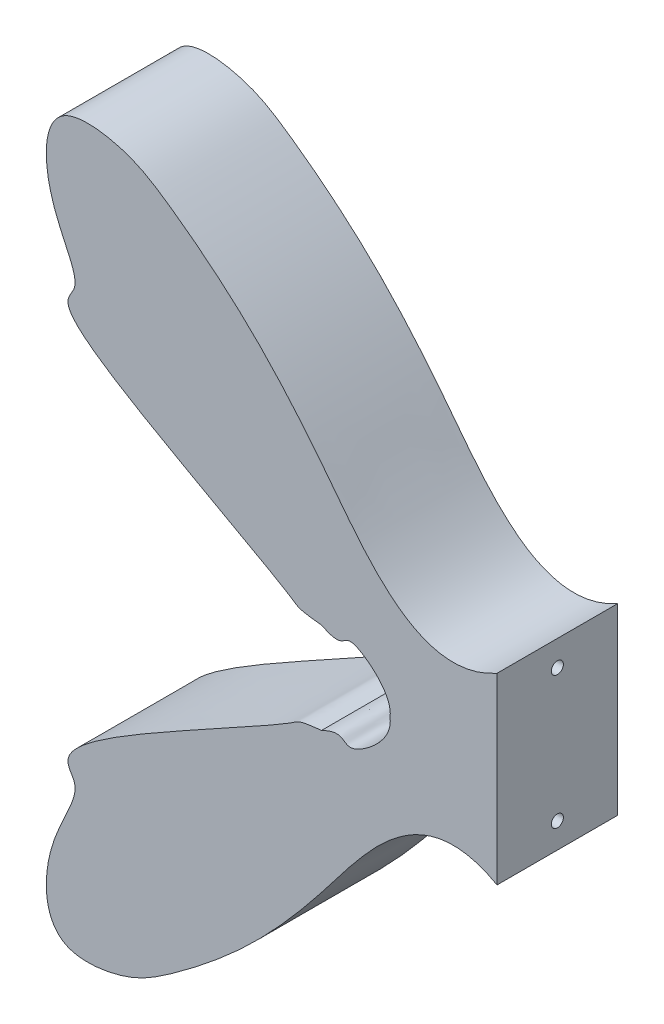
ISO-10303-21;
HEADER;
FILE_DESCRIPTION(('STEP AP214'),'2;1');
FILE_NAME('part.step','',(''),(''),'','','');
FILE_SCHEMA(('AUTOMOTIVE_DESIGN { 1 0 10303 214 1 1 1 1 }'));
ENDSEC;
DATA;
#1=APPLICATION_CONTEXT('core data for automotive mechanical design processes');
#2=APPLICATION_PROTOCOL_DEFINITION('international standard','automotive_design',2000,#1);
#3=PRODUCT_CONTEXT('',#1,'mechanical');
#4=PRODUCT('Part','Part','',(#3));
#5=PRODUCT_RELATED_PRODUCT_CATEGORY('part','',(#4));
#6=PRODUCT_DEFINITION_FORMATION('','',#4);
#7=PRODUCT_DEFINITION_CONTEXT('part definition',#1,'design');
#8=PRODUCT_DEFINITION('design','',#6,#7);
#9=PRODUCT_DEFINITION_SHAPE('','',#8);
#10=(LENGTH_UNIT() NAMED_UNIT(*) SI_UNIT(.MILLI.,.METRE.));
#11=(NAMED_UNIT(*) PLANE_ANGLE_UNIT() SI_UNIT($,.RADIAN.));
#12=(NAMED_UNIT(*) SI_UNIT($,.STERADIAN.) SOLID_ANGLE_UNIT());
#13=UNCERTAINTY_MEASURE_WITH_UNIT(LENGTH_MEASURE(1.E-05),#10,'distance_accuracy_value','');
#14=(GEOMETRIC_REPRESENTATION_CONTEXT(3) GLOBAL_UNCERTAINTY_ASSIGNED_CONTEXT((#13)) GLOBAL_UNIT_ASSIGNED_CONTEXT((#10,
#11,#12)) REPRESENTATION_CONTEXT('',''));
#15=CARTESIAN_POINT('',(0.,0.,0.));
#16=DIRECTION('',(0.,0.,1.));
#17=DIRECTION('',(1.,0.,0.));
#18=AXIS2_PLACEMENT_3D('',#15,#16,#17);
#19=CARTESIAN_POINT('',(71.6325104062925,15.197185343307,10.));
#20=DIRECTION('',(1.,0.,0.));
#21=DIRECTION('',(0.,0.,-1.));
#22=AXIS2_PLACEMENT_3D('',#19,#20,#21);
#23=PLANE('',#22);
#24=CARTESIAN_POINT('',(71.6325104062925,-11.,0.));
#25=DIRECTION('',(1.,0.,0.));
#26=DIRECTION('',(0.,0.,1.));
#27=AXIS2_PLACEMENT_3D('',#24,#25,#26);
#28=CIRCLE('',#27,1.);
#29=CARTESIAN_POINT('',(71.6325104062925,-11.,1.));
#30=VERTEX_POINT('',#29);
#31=EDGE_CURVE('E142',#30,#30,#28,.T.);
#32=ORIENTED_EDGE('',*,*,#31,.F.);
#33=EDGE_LOOP('',(#32));
#34=FACE_BOUND('',#33,.T.);
#35=CARTESIAN_POINT('',(71.6325104062925,11.,0.));
#36=DIRECTION('',(1.,0.,0.));
#37=DIRECTION('',(0.,0.,-1.));
#38=AXIS2_PLACEMENT_3D('',#35,#36,#37);
#39=CIRCLE('',#38,1.);
#40=CARTESIAN_POINT('',(71.6325104062925,11.,-1.));
#41=VERTEX_POINT('',#40);
#42=EDGE_CURVE('E145',#41,#41,#39,.T.);
#43=ORIENTED_EDGE('',*,*,#42,.F.);
#44=EDGE_LOOP('',(#43));
#45=FACE_BOUND('',#44,.T.);
#46=DIRECTION('',(0.,-1.,0.));
#47=VECTOR('',#46,1.);
#48=CARTESIAN_POINT('',(71.6325104062925,15.197185343307,-10.));
#49=LINE('',#48,#47);
#50=CARTESIAN_POINT('',(71.6325104062925,15.197185343307,-10.));
#51=VERTEX_POINT('',#50);
#52=CARTESIAN_POINT('',(71.6325104062925,-15.197185343307,-10.));
#53=VERTEX_POINT('',#52);
#54=EDGE_CURVE('E147',#51,#53,#49,.T.);
#55=ORIENTED_EDGE('',*,*,#54,.F.);
#56=DIRECTION('',(0.,0.,-1.));
#57=VECTOR('',#56,1.);
#58=CARTESIAN_POINT('',(71.6325104062925,15.197185343307,10.));
#59=LINE('',#58,#57);
#60=CARTESIAN_POINT('',(71.6325104062925,15.197185343307,10.));
#61=VERTEX_POINT('',#60);
#62=EDGE_CURVE('E11',#61,#51,#59,.T.);
#63=ORIENTED_EDGE('',*,*,#62,.F.);
#64=DIRECTION('',(0.,-1.,0.));
#65=VECTOR('',#64,1.);
#66=CARTESIAN_POINT('',(71.6325104062925,15.197185343307,10.));
#67=LINE('',#66,#65);
#68=CARTESIAN_POINT('',(71.6325104062925,-15.197185343307,10.));
#69=VERTEX_POINT('',#68);
#70=EDGE_CURVE('E106',#61,#69,#67,.T.);
#71=ORIENTED_EDGE('',*,*,#70,.T.);
#72=DIRECTION('',(0.,0.,-1.));
#73=VECTOR('',#72,1.);
#74=CARTESIAN_POINT('',(71.6325104062925,-15.197185343307,10.));
#75=LINE('',#74,#73);
#76=EDGE_CURVE('E35',#69,#53,#75,.T.);
#77=ORIENTED_EDGE('',*,*,#76,.T.);
#78=EDGE_LOOP('',(#55,#63,#71,#77));
#79=FACE_BOUND('',#78,.T.);
#80=ADVANCED_FACE('F32',(#34,#45,#79),#23,.T.);
#81=CARTESIAN_POINT('',(71.6325104062925,15.197185343307,10.));
#82=CARTESIAN_POINT('',(58.973888961801,8.0992342581893,10.));
#83=CARTESIAN_POINT('',(42.5680847183413,32.1575794687666,10.));
#84=CARTESIAN_POINT('',(28.361465025115,46.9535549101706,10.));
#85=CARTESIAN_POINT('',(16.4401867788423,55.9729933179655,10.));
#86=CARTESIAN_POINT('',(10.1282616814328,59.7584346686399,10.));
#87=CARTESIAN_POINT('',(-3.89444364924594,61.5978068543474,10.));
#88=CARTESIAN_POINT('',(-3.7829333087954,46.5834367053853,10.));
#89=CARTESIAN_POINT('',(4.75028643331209,33.6618351777044,10.));
#90=CARTESIAN_POINT('',(-6.00395995488576,32.3535590104221,10.));
#91=CARTESIAN_POINT('',(39.7190789756731,8.26661727159354,10.));
#92=CARTESIAN_POINT('',(38.5367870304603,8.00469770466996,10.));
#93=CARTESIAN_POINT('',(42.5385919506701,7.55434647529955,10.));
#94=B_SPLINE_CURVE_WITH_KNOTS('',3,(#81,#82,#83,#84,#85,#86,#87,#88,#89,#90,#91,#92,#93),
.UNSPECIFIED.,.F.,.F.,(4,1,1,1,1,1,1,1,1,1,4),(0.,0.127762807601043,0.242354711028437,
0.328153111034359,0.413844964762527,0.506383100526549,0.653085728314985,0.740125662354629,
0.845652717034787,0.902495187579424,0.926083421966984),.UNSPECIFIED.);
#95=DIRECTION('',(0.,0.,-1.));
#96=VECTOR('',#95,1.);
#97=SURFACE_OF_LINEAR_EXTRUSION('',#94,#96);
#98=CARTESIAN_POINT('',(71.6325104062925,15.197185343307,-10.));
#99=CARTESIAN_POINT('',(58.973888961801,8.0992342581893,-10.));
#100=CARTESIAN_POINT('',(42.5680847183413,32.1575794687666,-10.));
#101=CARTESIAN_POINT('',(28.361465025115,46.9535549101706,-10.));
#102=CARTESIAN_POINT('',(16.4401867788423,55.9729933179655,-10.));
#103=CARTESIAN_POINT('',(10.1282616814328,59.7584346686399,-10.));
#104=CARTESIAN_POINT('',(-3.89444364924594,61.5978068543474,-10.));
#105=CARTESIAN_POINT('',(-3.7829333087954,46.5834367053853,-10.));
#106=CARTESIAN_POINT('',(4.75028643331209,33.6618351777044,-10.));
#107=CARTESIAN_POINT('',(-6.00395995488576,32.3535590104221,-10.));
#108=CARTESIAN_POINT('',(39.7190789756731,8.26661727159354,-10.));
#109=CARTESIAN_POINT('',(38.5367870304603,8.00469770466996,-10.));
#110=CARTESIAN_POINT('',(42.5385919506701,7.55434647529955,-10.));
#111=B_SPLINE_CURVE_WITH_KNOTS('',3,(#98,#99,#100,#101,#102,#103,#104,#105,#106,#107,#108,#109,
#110),.UNSPECIFIED.,.F.,.F.,(4,1,1,1,1,1,1,1,1,1,4),(0.,0.127762807601043,0.242354711028437,
0.328153111034359,0.413844964762527,0.506383100526549,0.653085728314985,0.740125662354629,
0.845652717034787,0.902495187579424,0.926083421966984),.UNSPECIFIED.);
#112=CARTESIAN_POINT('',(42.5385919506701,7.55434647529955,-10.));
#113=VERTEX_POINT('',#112);
#114=EDGE_CURVE('E68',#51,#113,#111,.T.);
#115=ORIENTED_EDGE('',*,*,#114,.T.);
#116=DIRECTION('',(0.,0.,-1.));
#117=VECTOR('',#116,1.);
#118=CARTESIAN_POINT('',(42.5385919506701,7.55434647529955,10.));
#119=LINE('',#118,#117);
#120=CARTESIAN_POINT('',(42.5385919506701,7.55434647529955,10.));
#121=VERTEX_POINT('',#120);
#122=EDGE_CURVE('E41',#121,#113,#119,.T.);
#123=ORIENTED_EDGE('',*,*,#122,.F.);
#124=EDGE_CURVE('E90',#61,#121,#94,.T.);
#125=ORIENTED_EDGE('',*,*,#124,.F.);
#126=ORIENTED_EDGE('',*,*,#62,.T.);
#127=EDGE_LOOP('',(#115,#123,#125,#126));
#128=FACE_BOUND('',#127,.T.);
#129=ADVANCED_FACE('F134',(#128),#97,.F.);
#130=CARTESIAN_POINT('',(42.5385919506701,7.55434647529956,10.));
#131=CARTESIAN_POINT('',(47.0321058161497,5.30963101815585,10.));
#132=CARTESIAN_POINT('',(44.7788716135947,10.9369157337731,10.));
#133=CARTESIAN_POINT('',(54.3379106103023,3.13433053936766,10.));
#134=CARTESIAN_POINT('',(53.892711990341,0.,10.));
#135=B_SPLINE_CURVE_WITH_KNOTS('',3,(#130,#131,#132,#133,#134),.UNSPECIFIED.,.F.,.F.,(4,1,4),
(0.,0.786447222862614,1.26700053070628),.UNSPECIFIED.);
#136=DIRECTION('',(0.,0.,-1.));
#137=VECTOR('',#136,1.);
#138=SURFACE_OF_LINEAR_EXTRUSION('',#135,#137);
#139=CARTESIAN_POINT('',(42.5385919506701,7.55434647529956,-10.));
#140=CARTESIAN_POINT('',(47.0321058161497,5.30963101815585,-10.));
#141=CARTESIAN_POINT('',(44.7788716135947,10.9369157337731,-10.));
#142=CARTESIAN_POINT('',(54.3379106103023,3.13433053936766,-10.));
#143=CARTESIAN_POINT('',(53.892711990341,0.,-10.));
#144=B_SPLINE_CURVE_WITH_KNOTS('',3,(#139,#140,#141,#142,#143),.UNSPECIFIED.,.F.,.F.,(4,1,4),
(0.,0.786447222862614,1.26700053070628),.UNSPECIFIED.);
#145=CARTESIAN_POINT('',(53.892711990341,0.,-10.));
#146=VERTEX_POINT('',#145);
#147=EDGE_CURVE('E97',#113,#146,#144,.T.);
#148=ORIENTED_EDGE('',*,*,#147,.T.);
#149=DIRECTION('',(0.,0.,-1.));
#150=VECTOR('',#149,1.);
#151=CARTESIAN_POINT('',(53.892711990341,0.,10.));
#152=LINE('',#151,#150);
#153=CARTESIAN_POINT('',(53.892711990341,0.,10.));
#154=VERTEX_POINT('',#153);
#155=EDGE_CURVE('E94',#154,#146,#152,.T.);
#156=ORIENTED_EDGE('',*,*,#155,.F.);
#157=EDGE_CURVE('E84',#121,#154,#135,.T.);
#158=ORIENTED_EDGE('',*,*,#157,.F.);
#159=ORIENTED_EDGE('',*,*,#122,.T.);
#160=EDGE_LOOP('',(#148,#156,#158,#159));
#161=FACE_BOUND('',#160,.T.);
#162=ADVANCED_FACE('F95',(#161),#138,.F.);
#163=CARTESIAN_POINT('',(42.5385919506701,-7.55434647529956,10.));
#164=CARTESIAN_POINT('',(47.0321058161497,-5.30963101815585,10.));
#165=CARTESIAN_POINT('',(44.7788716135947,-10.9369157337731,10.));
#166=CARTESIAN_POINT('',(54.3379106103023,-3.13433053936766,10.));
#167=CARTESIAN_POINT('',(53.892711990341,0.,10.));
#168=B_SPLINE_CURVE_WITH_KNOTS('',3,(#163,#164,#165,#166,#167),.UNSPECIFIED.,.F.,.F.,(4,1,4),
(0.,0.786447222862614,1.26700053070628),.UNSPECIFIED.);
#169=DIRECTION('',(0.,0.,-1.));
#170=VECTOR('',#169,1.);
#171=SURFACE_OF_LINEAR_EXTRUSION('',#168,#170);
#172=CARTESIAN_POINT('',(42.5385919506701,-7.55434647529956,-10.));
#173=CARTESIAN_POINT('',(47.0321058161497,-5.30963101815585,-10.));
#174=CARTESIAN_POINT('',(44.7788716135947,-10.9369157337731,-10.));
#175=CARTESIAN_POINT('',(54.3379106103023,-3.13433053936766,-10.));
#176=CARTESIAN_POINT('',(53.892711990341,0.,-10.));
#177=B_SPLINE_CURVE_WITH_KNOTS('',3,(#172,#173,#174,#175,#176),.UNSPECIFIED.,.F.,.F.,(4,1,4),
(0.,0.786447222862614,1.26700053070628),.UNSPECIFIED.);
#178=CARTESIAN_POINT('',(42.5385919506701,-7.55434647529956,-10.));
#179=VERTEX_POINT('',#178);
#180=EDGE_CURVE('E153',#179,#146,#177,.T.);
#181=ORIENTED_EDGE('',*,*,#180,.F.);
#182=DIRECTION('',(0.,0.,-1.));
#183=VECTOR('',#182,1.);
#184=CARTESIAN_POINT('',(42.5385919506701,-7.55434647529956,10.));
#185=LINE('',#184,#183);
#186=CARTESIAN_POINT('',(42.5385919506701,-7.55434647529956,10.));
#187=VERTEX_POINT('',#186);
#188=EDGE_CURVE('E101',#187,#179,#185,.T.);
#189=ORIENTED_EDGE('',*,*,#188,.F.);
#190=EDGE_CURVE('E89',#187,#154,#168,.T.);
#191=ORIENTED_EDGE('',*,*,#190,.T.);
#192=ORIENTED_EDGE('',*,*,#155,.T.);
#193=EDGE_LOOP('',(#181,#189,#191,#192));
#194=FACE_BOUND('',#193,.T.);
#195=ADVANCED_FACE('F103',(#194),#171,.T.);
#196=CARTESIAN_POINT('',(71.6325104062925,-15.197185343307,10.));
#197=CARTESIAN_POINT('',(58.973888961801,-8.09923425818933,10.));
#198=CARTESIAN_POINT('',(42.5680847183413,-32.1575794687666,10.));
#199=CARTESIAN_POINT('',(28.361465025115,-46.9535549101706,10.));
#200=CARTESIAN_POINT('',(16.4401867788423,-55.9729933179655,10.));
#201=CARTESIAN_POINT('',(10.1282616814328,-59.7584346686399,10.));
#202=CARTESIAN_POINT('',(-3.89444364924594,-61.5978068543474,10.));
#203=CARTESIAN_POINT('',(-3.7829333087954,-46.5834367053853,10.));
#204=CARTESIAN_POINT('',(4.75028643331208,-33.6618351777044,10.));
#205=CARTESIAN_POINT('',(-6.00395995488576,-32.3535590104222,10.));
#206=CARTESIAN_POINT('',(39.719078975673,-8.26661727159354,10.));
#207=CARTESIAN_POINT('',(38.5367870304603,-8.00469770466996,10.));
#208=CARTESIAN_POINT('',(42.5385919506701,-7.55434647529955,10.));
#209=B_SPLINE_CURVE_WITH_KNOTS('',3,(#196,#197,#198,#199,#200,#201,#202,#203,#204,#205,#206,
#207,#208),.UNSPECIFIED.,.F.,.F.,(4,1,1,1,1,1,1,1,1,1,4),(0.,0.127762807601043,
0.242354711028437,0.328153111034359,0.413844964762527,0.506383100526549,0.653085728314985,
0.740125662354629,0.845652717034787,0.902495187579424,0.926083421966984),.UNSPECIFIED.);
#210=DIRECTION('',(0.,0.,-1.));
#211=VECTOR('',#210,1.);
#212=SURFACE_OF_LINEAR_EXTRUSION('',#209,#211);
#213=CARTESIAN_POINT('',(71.6325104062925,-15.197185343307,-10.));
#214=CARTESIAN_POINT('',(58.973888961801,-8.09923425818933,-10.));
#215=CARTESIAN_POINT('',(42.5680847183413,-32.1575794687666,-10.));
#216=CARTESIAN_POINT('',(28.361465025115,-46.9535549101706,-10.));
#217=CARTESIAN_POINT('',(16.4401867788423,-55.9729933179655,-10.));
#218=CARTESIAN_POINT('',(10.1282616814328,-59.7584346686399,-10.));
#219=CARTESIAN_POINT('',(-3.89444364924594,-61.5978068543474,-10.));
#220=CARTESIAN_POINT('',(-3.7829333087954,-46.5834367053853,-10.));
#221=CARTESIAN_POINT('',(4.75028643331208,-33.6618351777044,-10.));
#222=CARTESIAN_POINT('',(-6.00395995488576,-32.3535590104222,-10.));
#223=CARTESIAN_POINT('',(39.719078975673,-8.26661727159354,-10.));
#224=CARTESIAN_POINT('',(38.5367870304603,-8.00469770466996,-10.));
#225=CARTESIAN_POINT('',(42.5385919506701,-7.55434647529955,-10.));
#226=B_SPLINE_CURVE_WITH_KNOTS('',3,(#213,#214,#215,#216,#217,#218,#219,#220,#221,#222,#223,
#224,#225),.UNSPECIFIED.,.F.,.F.,(4,1,1,1,1,1,1,1,1,1,4),(0.,0.127762807601043,
0.242354711028437,0.328153111034359,0.413844964762527,0.506383100526549,0.653085728314985,
0.740125662354629,0.845652717034787,0.902495187579424,0.926083421966984),.UNSPECIFIED.);
#227=EDGE_CURVE('E150',#53,#179,#226,.T.);
#228=ORIENTED_EDGE('',*,*,#227,.F.);
#229=ORIENTED_EDGE('',*,*,#76,.F.);
#230=EDGE_CURVE('E104',#69,#187,#209,.T.);
#231=ORIENTED_EDGE('',*,*,#230,.T.);
#232=ORIENTED_EDGE('',*,*,#188,.T.);
#233=EDGE_LOOP('',(#228,#229,#231,#232));
#234=FACE_BOUND('',#233,.T.);
#235=ADVANCED_FACE('F125',(#234),#212,.T.);
#236=CARTESIAN_POINT('',(4.1932775577435,-60.2343827134994,10.));
#237=DIRECTION('',(0.,0.,-1.));
#238=DIRECTION('',(-1.,0.,0.));
#239=AXIS2_PLACEMENT_3D('',#236,#237,#238);
#240=PLANE('',#239);
#241=ORIENTED_EDGE('',*,*,#70,.F.);
#242=ORIENTED_EDGE('',*,*,#124,.T.);
#243=ORIENTED_EDGE('',*,*,#157,.T.);
#244=ORIENTED_EDGE('',*,*,#190,.F.);
#245=ORIENTED_EDGE('',*,*,#230,.F.);
#246=EDGE_LOOP('',(#241,#242,#243,#244,#245));
#247=FACE_BOUND('',#246,.T.);
#248=ADVANCED_FACE('F87',(#247),#240,.F.);
#249=CARTESIAN_POINT('',(4.1932775577435,-60.2343827134994,-10.));
#250=DIRECTION('',(0.,0.,-1.));
#251=DIRECTION('',(-1.,0.,0.));
#252=AXIS2_PLACEMENT_3D('',#249,#250,#251);
#253=PLANE('',#252);
#254=ORIENTED_EDGE('',*,*,#54,.T.);
#255=ORIENTED_EDGE('',*,*,#227,.T.);
#256=ORIENTED_EDGE('',*,*,#180,.T.);
#257=ORIENTED_EDGE('',*,*,#147,.F.);
#258=ORIENTED_EDGE('',*,*,#114,.F.);
#259=EDGE_LOOP('',(#254,#255,#256,#257,#258));
#260=FACE_BOUND('',#259,.T.);
#261=ADVANCED_FACE('F131',(#260),#253,.T.);
#262=CARTESIAN_POINT('',(66.6325104062925,11.,0.));
#263=DIRECTION('',(1.,0.,0.));
#264=DIRECTION('',(0.,0.,-1.));
#265=AXIS2_PLACEMENT_3D('',#262,#263,#264);
#266=CYLINDRICAL_SURFACE('',#265,1.);
#267=CARTESIAN_POINT('',(66.6325104062925,11.,0.));
#268=DIRECTION('',(1.,0.,0.));
#269=DIRECTION('',(0.,0.,-1.));
#270=AXIS2_PLACEMENT_3D('',#267,#268,#269);
#271=CIRCLE('',#270,1.);
#272=CARTESIAN_POINT('',(66.6325104062925,11.,-1.));
#273=VERTEX_POINT('',#272);
#274=EDGE_CURVE('E151',#273,#273,#271,.T.);
#275=ORIENTED_EDGE('',*,*,#274,.F.);
#276=EDGE_LOOP('',(#275));
#277=FACE_BOUND('',#276,.T.);
#278=ORIENTED_EDGE('',*,*,#42,.T.);
#279=EDGE_LOOP('',(#278));
#280=FACE_BOUND('',#279,.T.);
#281=ADVANCED_FACE('F185',(#277,#280),#266,.F.);
#282=CARTESIAN_POINT('',(66.6325104062925,11.,0.));
#283=DIRECTION('',(1.,0.,0.));
#284=DIRECTION('',(0.,0.,-1.));
#285=AXIS2_PLACEMENT_3D('',#282,#283,#284);
#286=PLANE('',#285);
#287=ORIENTED_EDGE('',*,*,#274,.T.);
#288=EDGE_LOOP('',(#287));
#289=FACE_BOUND('',#288,.T.);
#290=ADVANCED_FACE('F190',(#289),#286,.T.);
#291=CARTESIAN_POINT('',(66.6325104062925,-11.,0.));
#292=DIRECTION('',(1.,0.,0.));
#293=DIRECTION('',(0.,0.,-1.));
#294=AXIS2_PLACEMENT_3D('',#291,#292,#293);
#295=CYLINDRICAL_SURFACE('',#294,1.);
#296=CARTESIAN_POINT('',(66.6325104062925,-11.,0.));
#297=DIRECTION('',(1.,0.,0.));
#298=DIRECTION('',(0.,0.,1.));
#299=AXIS2_PLACEMENT_3D('',#296,#297,#298);
#300=CIRCLE('',#299,1.);
#301=CARTESIAN_POINT('',(66.6325104062925,-11.,1.));
#302=VERTEX_POINT('',#301);
#303=EDGE_CURVE('E208',#302,#302,#300,.T.);
#304=ORIENTED_EDGE('',*,*,#303,.F.);
#305=EDGE_LOOP('',(#304));
#306=FACE_BOUND('',#305,.T.);
#307=ORIENTED_EDGE('',*,*,#31,.T.);
#308=EDGE_LOOP('',(#307));
#309=FACE_BOUND('',#308,.T.);
#310=ADVANCED_FACE('F196',(#306,#309),#295,.F.);
#311=CARTESIAN_POINT('',(66.6325104062925,-11.,0.));
#312=DIRECTION('',(-1.,0.,0.));
#313=DIRECTION('',(0.,0.,1.));
#314=AXIS2_PLACEMENT_3D('',#311,#312,#313);
#315=PLANE('',#314);
#316=ORIENTED_EDGE('',*,*,#303,.T.);
#317=EDGE_LOOP('',(#316));
#318=FACE_BOUND('',#317,.T.);
#319=ADVANCED_FACE('F200',(#318),#315,.F.);
#320=CLOSED_SHELL('',(#80,#129,#162,#195,#235,#248,#261,#281,#290,#310,#319));
#321=MANIFOLD_SOLID_BREP('B2',#320);
#322=ADVANCED_BREP_SHAPE_REPRESENTATION('',(#18,#321),#14);
#323=SHAPE_DEFINITION_REPRESENTATION(#9,#322);
ENDSEC;
END-ISO-10303-21;
